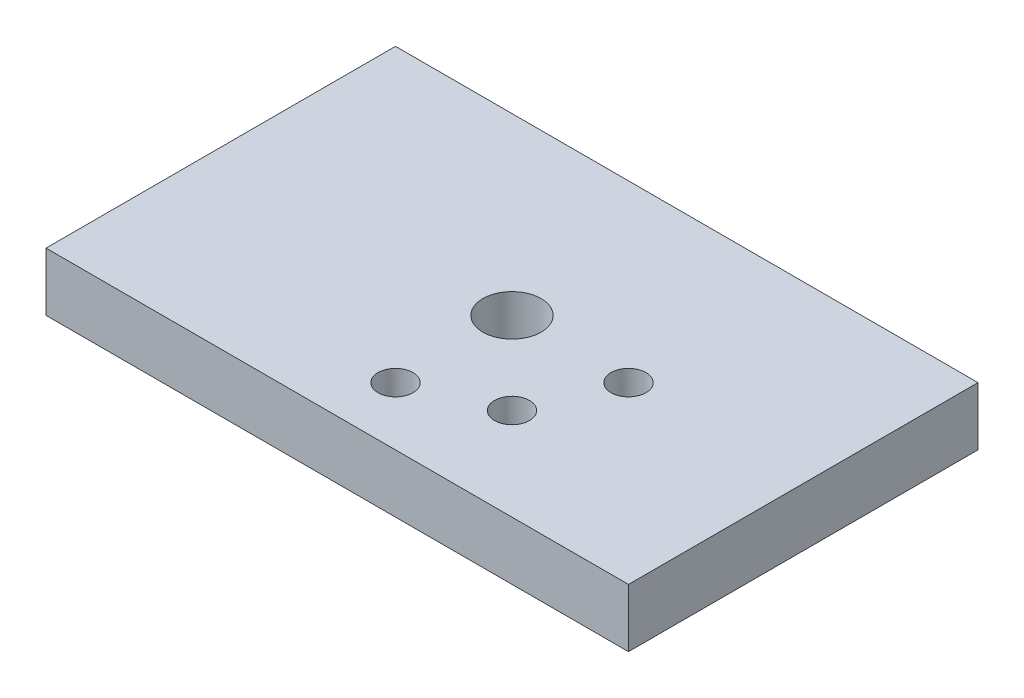
ISO-10303-21;
HEADER;
FILE_DESCRIPTION(('STEP AP214'),'2;1');
FILE_NAME('part.step','',(''),(''),'','','');
FILE_SCHEMA(('AUTOMOTIVE_DESIGN { 1 0 10303 214 1 1 1 1 }'));
ENDSEC;
DATA;
#1=APPLICATION_CONTEXT('core data for automotive mechanical design processes');
#2=APPLICATION_PROTOCOL_DEFINITION('international standard','automotive_design',2000,#1);
#3=PRODUCT_CONTEXT('',#1,'mechanical');
#4=PRODUCT('Part','Part','',(#3));
#5=PRODUCT_RELATED_PRODUCT_CATEGORY('part','',(#4));
#6=PRODUCT_DEFINITION_FORMATION('','',#4);
#7=PRODUCT_DEFINITION_CONTEXT('part definition',#1,'design');
#8=PRODUCT_DEFINITION('design','',#6,#7);
#9=PRODUCT_DEFINITION_SHAPE('','',#8);
#10=(LENGTH_UNIT() NAMED_UNIT(*) SI_UNIT(.MILLI.,.METRE.));
#11=(NAMED_UNIT(*) PLANE_ANGLE_UNIT() SI_UNIT($,.RADIAN.));
#12=(NAMED_UNIT(*) SI_UNIT($,.STERADIAN.) SOLID_ANGLE_UNIT());
#13=UNCERTAINTY_MEASURE_WITH_UNIT(LENGTH_MEASURE(1.E-05),#10,'distance_accuracy_value','');
#14=(GEOMETRIC_REPRESENTATION_CONTEXT(3) GLOBAL_UNCERTAINTY_ASSIGNED_CONTEXT((#13)) GLOBAL_UNIT_ASSIGNED_CONTEXT((#10,
#11,#12)) REPRESENTATION_CONTEXT('',''));
#15=CARTESIAN_POINT('',(0.,0.,0.));
#16=DIRECTION('',(0.,0.,1.));
#17=DIRECTION('',(1.,0.,0.));
#18=AXIS2_PLACEMENT_3D('',#15,#16,#17);
#19=CARTESIAN_POINT('',(50.,10.,30.));
#20=DIRECTION('',(-1.,0.,0.));
#21=DIRECTION('',(0.,0.,1.));
#22=AXIS2_PLACEMENT_3D('',#19,#20,#21);
#23=PLANE('',#22);
#24=DIRECTION('',(0.,0.,-1.));
#25=VECTOR('',#24,1.);
#26=CARTESIAN_POINT('',(50.,0.,30.));
#27=LINE('',#26,#25);
#28=CARTESIAN_POINT('',(50.,0.,30.));
#29=VERTEX_POINT('',#28);
#30=CARTESIAN_POINT('',(50.,0.,-30.));
#31=VERTEX_POINT('',#30);
#32=EDGE_CURVE('E102',#29,#31,#27,.T.);
#33=ORIENTED_EDGE('',*,*,#32,.T.);
#34=DIRECTION('',(0.,-1.,0.));
#35=VECTOR('',#34,1.);
#36=CARTESIAN_POINT('',(50.,10.,-30.));
#37=LINE('',#36,#35);
#38=CARTESIAN_POINT('',(50.,10.,-30.));
#39=VERTEX_POINT('',#38);
#40=EDGE_CURVE('E11',#39,#31,#37,.T.);
#41=ORIENTED_EDGE('',*,*,#40,.F.);
#42=DIRECTION('',(0.,0.,-1.));
#43=VECTOR('',#42,1.);
#44=CARTESIAN_POINT('',(50.,10.,30.));
#45=LINE('',#44,#43);
#46=CARTESIAN_POINT('',(50.,10.,30.));
#47=VERTEX_POINT('',#46);
#48=EDGE_CURVE('E90',#47,#39,#45,.T.);
#49=ORIENTED_EDGE('',*,*,#48,.F.);
#50=DIRECTION('',(0.,-1.,0.));
#51=VECTOR('',#50,1.);
#52=CARTESIAN_POINT('',(50.,10.,30.));
#53=LINE('',#52,#51);
#54=EDGE_CURVE('E98',#47,#29,#53,.T.);
#55=ORIENTED_EDGE('',*,*,#54,.T.);
#56=EDGE_LOOP('',(#33,#41,#49,#55));
#57=FACE_BOUND('',#56,.T.);
#58=ADVANCED_FACE('F39',(#57),#23,.F.);
#59=CARTESIAN_POINT('',(-50.,10.,-30.));
#60=DIRECTION('',(0.,0.,1.));
#61=DIRECTION('',(1.,0.,0.));
#62=AXIS2_PLACEMENT_3D('',#59,#60,#61);
#63=PLANE('',#62);
#64=DIRECTION('',(-1.,0.,0.));
#65=VECTOR('',#64,1.);
#66=CARTESIAN_POINT('',(-50.,0.,-30.));
#67=LINE('',#66,#65);
#68=CARTESIAN_POINT('',(-50.,0.,-30.));
#69=VERTEX_POINT('',#68);
#70=EDGE_CURVE('E94',#31,#69,#67,.T.);
#71=ORIENTED_EDGE('',*,*,#70,.T.);
#72=DIRECTION('',(0.,-1.,0.));
#73=VECTOR('',#72,1.);
#74=CARTESIAN_POINT('',(-50.,10.,-30.));
#75=LINE('',#74,#73);
#76=CARTESIAN_POINT('',(-50.,10.,-30.));
#77=VERTEX_POINT('',#76);
#78=EDGE_CURVE('E47',#77,#69,#75,.T.);
#79=ORIENTED_EDGE('',*,*,#78,.F.);
#80=DIRECTION('',(-1.,0.,0.));
#81=VECTOR('',#80,1.);
#82=CARTESIAN_POINT('',(-50.,10.,-30.));
#83=LINE('',#82,#81);
#84=EDGE_CURVE('E85',#39,#77,#83,.T.);
#85=ORIENTED_EDGE('',*,*,#84,.F.);
#86=ORIENTED_EDGE('',*,*,#40,.T.);
#87=EDGE_LOOP('',(#71,#79,#85,#86));
#88=FACE_BOUND('',#87,.T.);
#89=ADVANCED_FACE('F93',(#88),#63,.F.);
#90=CARTESIAN_POINT('',(-50.,10.,30.));
#91=DIRECTION('',(1.,0.,0.));
#92=DIRECTION('',(0.,0.,-1.));
#93=AXIS2_PLACEMENT_3D('',#90,#91,#92);
#94=PLANE('',#93);
#95=DIRECTION('',(0.,0.,1.));
#96=VECTOR('',#95,1.);
#97=CARTESIAN_POINT('',(-50.,0.,30.));
#98=LINE('',#97,#96);
#99=CARTESIAN_POINT('',(-50.,0.,30.));
#100=VERTEX_POINT('',#99);
#101=EDGE_CURVE('E72',#69,#100,#98,.T.);
#102=ORIENTED_EDGE('',*,*,#101,.T.);
#103=DIRECTION('',(0.,-1.,0.));
#104=VECTOR('',#103,1.);
#105=CARTESIAN_POINT('',(-50.,10.,30.));
#106=LINE('',#105,#104);
#107=CARTESIAN_POINT('',(-50.,10.,30.));
#108=VERTEX_POINT('',#107);
#109=EDGE_CURVE('E95',#108,#100,#106,.T.);
#110=ORIENTED_EDGE('',*,*,#109,.F.);
#111=DIRECTION('',(0.,0.,1.));
#112=VECTOR('',#111,1.);
#113=CARTESIAN_POINT('',(-50.,10.,30.));
#114=LINE('',#113,#112);
#115=EDGE_CURVE('E88',#77,#108,#114,.T.);
#116=ORIENTED_EDGE('',*,*,#115,.F.);
#117=ORIENTED_EDGE('',*,*,#78,.T.);
#118=EDGE_LOOP('',(#102,#110,#116,#117));
#119=FACE_BOUND('',#118,.T.);
#120=ADVANCED_FACE('F96',(#119),#94,.F.);
#121=CARTESIAN_POINT('',(-50.,10.,30.));
#122=DIRECTION('',(0.,0.,-1.));
#123=DIRECTION('',(-1.,0.,0.));
#124=AXIS2_PLACEMENT_3D('',#121,#122,#123);
#125=PLANE('',#124);
#126=DIRECTION('',(1.,0.,0.));
#127=VECTOR('',#126,1.);
#128=CARTESIAN_POINT('',(-50.,0.,30.));
#129=LINE('',#128,#127);
#130=EDGE_CURVE('E78',#100,#29,#129,.T.);
#131=ORIENTED_EDGE('',*,*,#130,.T.);
#132=ORIENTED_EDGE('',*,*,#54,.F.);
#133=DIRECTION('',(1.,0.,0.));
#134=VECTOR('',#133,1.);
#135=CARTESIAN_POINT('',(-50.,10.,30.));
#136=LINE('',#135,#134);
#137=EDGE_CURVE('E55',#108,#47,#136,.T.);
#138=ORIENTED_EDGE('',*,*,#137,.F.);
#139=ORIENTED_EDGE('',*,*,#109,.T.);
#140=EDGE_LOOP('',(#131,#132,#138,#139));
#141=FACE_BOUND('',#140,.T.);
#142=ADVANCED_FACE('F110',(#141),#125,.F.);
#143=CARTESIAN_POINT('',(0.,10.,0.));
#144=DIRECTION('',(0.,-1.,0.));
#145=DIRECTION('',(0.,0.,-1.));
#146=AXIS2_PLACEMENT_3D('',#143,#144,#145);
#147=PLANE('',#146);
#148=CARTESIAN_POINT('',(14.142135623731,10.,14.142135623731));
#149=DIRECTION('',(0.,-1.,0.));
#150=DIRECTION('',(0.,0.,-1.));
#151=AXIS2_PLACEMENT_3D('',#148,#149,#150);
#152=CIRCLE('',#151,3.);
#153=CARTESIAN_POINT('',(14.142135623731,10.,11.142135623731));
#154=VERTEX_POINT('',#153);
#155=EDGE_CURVE('E127',#154,#154,#152,.F.);
#156=ORIENTED_EDGE('',*,*,#155,.F.);
#157=EDGE_LOOP('',(#156));
#158=FACE_BOUND('',#157,.T.);
#159=CARTESIAN_POINT('',(0.,10.,20.));
#160=DIRECTION('',(0.,-1.,0.));
#161=DIRECTION('',(0.,0.,-1.));
#162=AXIS2_PLACEMENT_3D('',#159,#160,#161);
#163=CIRCLE('',#162,3.);
#164=CARTESIAN_POINT('',(0.,10.,17.));
#165=VERTEX_POINT('',#164);
#166=EDGE_CURVE('E130',#165,#165,#163,.F.);
#167=ORIENTED_EDGE('',*,*,#166,.F.);
#168=EDGE_LOOP('',(#167));
#169=FACE_BOUND('',#168,.T.);
#170=CARTESIAN_POINT('',(20.,10.,0.));
#171=DIRECTION('',(0.,-1.,0.));
#172=DIRECTION('',(0.,0.,-1.));
#173=AXIS2_PLACEMENT_3D('',#170,#171,#172);
#174=CIRCLE('',#173,3.);
#175=CARTESIAN_POINT('',(20.,10.,-3.));
#176=VERTEX_POINT('',#175);
#177=EDGE_CURVE('E121',#176,#176,#174,.F.);
#178=ORIENTED_EDGE('',*,*,#177,.F.);
#179=EDGE_LOOP('',(#178));
#180=FACE_BOUND('',#179,.T.);
#181=CARTESIAN_POINT('',(0.,10.,0.));
#182=DIRECTION('',(0.,-1.,0.));
#183=DIRECTION('',(0.,0.,-1.));
#184=AXIS2_PLACEMENT_3D('',#181,#182,#183);
#185=CIRCLE('',#184,5.);
#186=CARTESIAN_POINT('',(0.,10.,-5.));
#187=VERTEX_POINT('',#186);
#188=EDGE_CURVE('E105',#187,#187,#185,.F.);
#189=ORIENTED_EDGE('',*,*,#188,.F.);
#190=EDGE_LOOP('',(#189));
#191=FACE_BOUND('',#190,.T.);
#192=ORIENTED_EDGE('',*,*,#48,.T.);
#193=ORIENTED_EDGE('',*,*,#84,.T.);
#194=ORIENTED_EDGE('',*,*,#115,.T.);
#195=ORIENTED_EDGE('',*,*,#137,.T.);
#196=EDGE_LOOP('',(#192,#193,#194,#195));
#197=FACE_BOUND('',#196,.T.);
#198=ADVANCED_FACE('F86',(#158,#169,#180,#191,#197),#147,.F.);
#199=CARTESIAN_POINT('',(0.,0.,0.));
#200=DIRECTION('',(0.,-1.,0.));
#201=DIRECTION('',(0.,0.,-1.));
#202=AXIS2_PLACEMENT_3D('',#199,#200,#201);
#203=PLANE('',#202);
#204=CARTESIAN_POINT('',(14.142135623731,0.,14.142135623731));
#205=DIRECTION('',(0.,1.,0.));
#206=DIRECTION('',(-0.707106781186548,0.,0.707106781186548));
#207=AXIS2_PLACEMENT_3D('',#204,#205,#206);
#208=CIRCLE('',#207,3.);
#209=CARTESIAN_POINT('',(12.0208152801713,0.,16.2634559672906));
#210=VERTEX_POINT('',#209);
#211=EDGE_CURVE('E133',#210,#210,#208,.T.);
#212=ORIENTED_EDGE('',*,*,#211,.T.);
#213=EDGE_LOOP('',(#212));
#214=FACE_BOUND('',#213,.T.);
#215=CARTESIAN_POINT('',(0.,0.,20.));
#216=DIRECTION('',(0.,1.,0.));
#217=DIRECTION('',(-1.,0.,0.));
#218=AXIS2_PLACEMENT_3D('',#215,#216,#217);
#219=CIRCLE('',#218,3.);
#220=CARTESIAN_POINT('',(-3.,0.,20.));
#221=VERTEX_POINT('',#220);
#222=EDGE_CURVE('E134',#221,#221,#219,.T.);
#223=ORIENTED_EDGE('',*,*,#222,.T.);
#224=EDGE_LOOP('',(#223));
#225=FACE_BOUND('',#224,.T.);
#226=CARTESIAN_POINT('',(20.,0.,0.));
#227=DIRECTION('',(0.,1.,0.));
#228=DIRECTION('',(0.,0.,1.));
#229=AXIS2_PLACEMENT_3D('',#226,#227,#228);
#230=CIRCLE('',#229,3.);
#231=CARTESIAN_POINT('',(20.,0.,3.));
#232=VERTEX_POINT('',#231);
#233=EDGE_CURVE('E124',#232,#232,#230,.T.);
#234=ORIENTED_EDGE('',*,*,#233,.T.);
#235=EDGE_LOOP('',(#234));
#236=FACE_BOUND('',#235,.T.);
#237=CARTESIAN_POINT('',(0.,0.,0.));
#238=DIRECTION('',(0.,1.,0.));
#239=DIRECTION('',(0.,0.,1.));
#240=AXIS2_PLACEMENT_3D('',#237,#238,#239);
#241=CIRCLE('',#240,5.);
#242=CARTESIAN_POINT('',(0.,0.,5.));
#243=VERTEX_POINT('',#242);
#244=EDGE_CURVE('E118',#243,#243,#241,.T.);
#245=ORIENTED_EDGE('',*,*,#244,.T.);
#246=EDGE_LOOP('',(#245));
#247=FACE_BOUND('',#246,.T.);
#248=ORIENTED_EDGE('',*,*,#32,.F.);
#249=ORIENTED_EDGE('',*,*,#130,.F.);
#250=ORIENTED_EDGE('',*,*,#101,.F.);
#251=ORIENTED_EDGE('',*,*,#70,.F.);
#252=EDGE_LOOP('',(#248,#249,#250,#251));
#253=FACE_BOUND('',#252,.T.);
#254=ADVANCED_FACE('F113',(#214,#225,#236,#247,#253),#203,.T.);
#255=CARTESIAN_POINT('',(0.,20.,0.));
#256=DIRECTION('',(0.,-1.,0.));
#257=DIRECTION('',(0.,0.,-1.));
#258=AXIS2_PLACEMENT_3D('',#255,#256,#257);
#259=CYLINDRICAL_SURFACE('',#258,5.);
#260=ORIENTED_EDGE('',*,*,#244,.F.);
#261=EDGE_LOOP('',(#260));
#262=FACE_BOUND('',#261,.T.);
#263=ORIENTED_EDGE('',*,*,#188,.T.);
#264=EDGE_LOOP('',(#263));
#265=FACE_BOUND('',#264,.T.);
#266=ADVANCED_FACE('F158',(#262,#265),#259,.F.);
#267=CARTESIAN_POINT('',(20.,20.,0.));
#268=DIRECTION('',(0.,-1.,0.));
#269=DIRECTION('',(0.,0.,-1.));
#270=AXIS2_PLACEMENT_3D('',#267,#268,#269);
#271=CYLINDRICAL_SURFACE('',#270,3.);
#272=ORIENTED_EDGE('',*,*,#233,.F.);
#273=EDGE_LOOP('',(#272));
#274=FACE_BOUND('',#273,.T.);
#275=ORIENTED_EDGE('',*,*,#177,.T.);
#276=EDGE_LOOP('',(#275));
#277=FACE_BOUND('',#276,.T.);
#278=ADVANCED_FACE('F160',(#274,#277),#271,.F.);
#279=CARTESIAN_POINT('',(0.,20.,20.));
#280=DIRECTION('',(0.,-1.,0.));
#281=DIRECTION('',(0.,0.,-1.));
#282=AXIS2_PLACEMENT_3D('',#279,#280,#281);
#283=CYLINDRICAL_SURFACE('',#282,3.);
#284=ORIENTED_EDGE('',*,*,#222,.F.);
#285=EDGE_LOOP('',(#284));
#286=FACE_BOUND('',#285,.T.);
#287=ORIENTED_EDGE('',*,*,#166,.T.);
#288=EDGE_LOOP('',(#287));
#289=FACE_BOUND('',#288,.T.);
#290=ADVANCED_FACE('F145',(#286,#289),#283,.F.);
#291=CARTESIAN_POINT('',(14.142135623731,20.,14.142135623731));
#292=DIRECTION('',(0.,-1.,0.));
#293=DIRECTION('',(0.,0.,-1.));
#294=AXIS2_PLACEMENT_3D('',#291,#292,#293);
#295=CYLINDRICAL_SURFACE('',#294,3.);
#296=ORIENTED_EDGE('',*,*,#211,.F.);
#297=EDGE_LOOP('',(#296));
#298=FACE_BOUND('',#297,.T.);
#299=ORIENTED_EDGE('',*,*,#155,.T.);
#300=EDGE_LOOP('',(#299));
#301=FACE_BOUND('',#300,.T.);
#302=ADVANCED_FACE('F142',(#298,#301),#295,.F.);
#303=CLOSED_SHELL('',(#58,#89,#120,#142,#198,#254,#266,#278,#290,#302));
#304=MANIFOLD_SOLID_BREP('B2',#303);
#305=ADVANCED_BREP_SHAPE_REPRESENTATION('',(#18,#304),#14);
#306=SHAPE_DEFINITION_REPRESENTATION(#9,#305);
ENDSEC;
END-ISO-10303-21;
